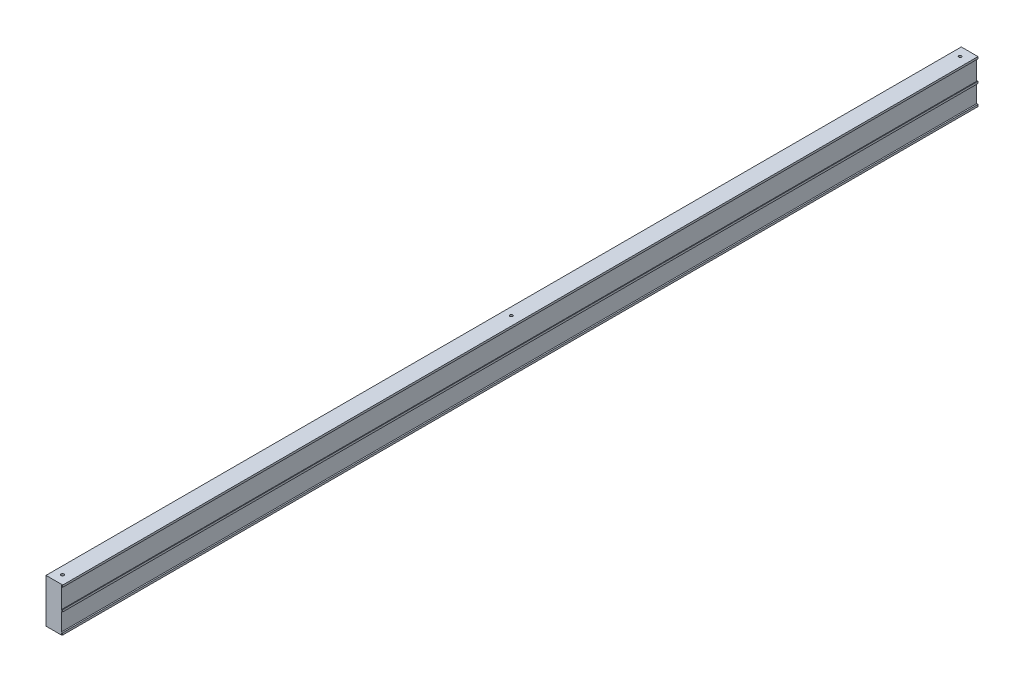
ISO-10303-21;
HEADER;
FILE_DESCRIPTION(('STEP AP214'),'2;1');
FILE_NAME('part.step','',(''),(''),'','','');
FILE_SCHEMA(('AUTOMOTIVE_DESIGN { 1 0 10303 214 1 1 1 1 }'));
ENDSEC;
DATA;
#1=APPLICATION_CONTEXT('core data for automotive mechanical design processes');
#2=APPLICATION_PROTOCOL_DEFINITION('international standard','automotive_design',2000,#1);
#3=PRODUCT_CONTEXT('',#1,'mechanical');
#4=PRODUCT('Part','Part','',(#3));
#5=PRODUCT_RELATED_PRODUCT_CATEGORY('part','',(#4));
#6=PRODUCT_DEFINITION_FORMATION('','',#4);
#7=PRODUCT_DEFINITION_CONTEXT('part definition',#1,'design');
#8=PRODUCT_DEFINITION('design','',#6,#7);
#9=PRODUCT_DEFINITION_SHAPE('','',#8);
#10=(LENGTH_UNIT() NAMED_UNIT(*) SI_UNIT(.MILLI.,.METRE.));
#11=(NAMED_UNIT(*) PLANE_ANGLE_UNIT() SI_UNIT($,.RADIAN.));
#12=(NAMED_UNIT(*) SI_UNIT($,.STERADIAN.) SOLID_ANGLE_UNIT());
#13=UNCERTAINTY_MEASURE_WITH_UNIT(LENGTH_MEASURE(1.E-05),#10,'distance_accuracy_value','');
#14=(GEOMETRIC_REPRESENTATION_CONTEXT(3) GLOBAL_UNCERTAINTY_ASSIGNED_CONTEXT((#13)) GLOBAL_UNIT_ASSIGNED_CONTEXT((#10,
#11,#12)) REPRESENTATION_CONTEXT('',''));
#15=CARTESIAN_POINT('',(0.,0.,0.));
#16=DIRECTION('',(0.,0.,1.));
#17=DIRECTION('',(1.,0.,0.));
#18=AXIS2_PLACEMENT_3D('',#15,#16,#17);
#19=CARTESIAN_POINT('',(-17.5,-50.,2080.));
#20=DIRECTION('',(1.,0.,0.));
#21=DIRECTION('',(0.,0.,-1.));
#22=AXIS2_PLACEMENT_3D('',#19,#20,#21);
#23=PLANE('',#22);
#24=DIRECTION('',(0.,-1.,0.));
#25=VECTOR('',#24,1.);
#26=CARTESIAN_POINT('',(-17.5,-50.,0.));
#27=LINE('',#26,#25);
#28=CARTESIAN_POINT('',(-17.5,50.,0.));
#29=VERTEX_POINT('',#28);
#30=CARTESIAN_POINT('',(-17.5,-50.,0.));
#31=VERTEX_POINT('',#30);
#32=EDGE_CURVE('E210',#29,#31,#27,.T.);
#33=ORIENTED_EDGE('',*,*,#32,.T.);
#34=DIRECTION('',(0.,0.,-1.));
#35=VECTOR('',#34,1.);
#36=CARTESIAN_POINT('',(-17.5,-50.,2080.));
#37=LINE('',#36,#35);
#38=CARTESIAN_POINT('',(-17.5,-50.,2080.));
#39=VERTEX_POINT('',#38);
#40=EDGE_CURVE('E46',#39,#31,#37,.T.);
#41=ORIENTED_EDGE('',*,*,#40,.F.);
#42=DIRECTION('',(0.,-1.,0.));
#43=VECTOR('',#42,1.);
#44=CARTESIAN_POINT('',(-17.5,-50.,2080.));
#45=LINE('',#44,#43);
#46=CARTESIAN_POINT('',(-17.5,50.,2080.));
#47=VERTEX_POINT('',#46);
#48=EDGE_CURVE('E134',#47,#39,#45,.T.);
#49=ORIENTED_EDGE('',*,*,#48,.F.);
#50=DIRECTION('',(0.,0.,-1.));
#51=VECTOR('',#50,1.);
#52=CARTESIAN_POINT('',(-17.5,50.,2080.));
#53=LINE('',#52,#51);
#54=EDGE_CURVE('E11',#47,#29,#53,.T.);
#55=ORIENTED_EDGE('',*,*,#54,.T.);
#56=EDGE_LOOP('',(#33,#41,#49,#55));
#57=FACE_BOUND('',#56,.T.);
#58=ADVANCED_FACE('F38',(#57),#23,.F.);
#59=CARTESIAN_POINT('',(-17.5,-50.,2080.));
#60=DIRECTION('',(0.,1.,0.));
#61=DIRECTION('',(0.,0.,1.));
#62=AXIS2_PLACEMENT_3D('',#59,#60,#61);
#63=PLANE('',#62);
#64=DIRECTION('',(1.,0.,0.));
#65=VECTOR('',#64,1.);
#66=CARTESIAN_POINT('',(-17.5,-50.,0.));
#67=LINE('',#66,#65);
#68=CARTESIAN_POINT('',(17.5,-50.,0.));
#69=VERTEX_POINT('',#68);
#70=EDGE_CURVE('E212',#31,#69,#67,.T.);
#71=ORIENTED_EDGE('',*,*,#70,.T.);
#72=DIRECTION('',(0.,0.,-1.));
#73=VECTOR('',#72,1.);
#74=CARTESIAN_POINT('',(17.5,-50.,2080.));
#75=LINE('',#74,#73);
#76=CARTESIAN_POINT('',(17.5,-50.,2080.));
#77=VERTEX_POINT('',#76);
#78=EDGE_CURVE('E290',#77,#69,#75,.T.);
#79=ORIENTED_EDGE('',*,*,#78,.F.);
#80=DIRECTION('',(1.,0.,0.));
#81=VECTOR('',#80,1.);
#82=CARTESIAN_POINT('',(-17.5,-50.,2080.));
#83=LINE('',#82,#81);
#84=EDGE_CURVE('E298',#39,#77,#83,.T.);
#85=ORIENTED_EDGE('',*,*,#84,.F.);
#86=ORIENTED_EDGE('',*,*,#40,.T.);
#87=EDGE_LOOP('',(#71,#79,#85,#86));
#88=FACE_BOUND('',#87,.T.);
#89=ADVANCED_FACE('F296',(#88),#63,.F.);
#90=CARTESIAN_POINT('',(17.5,-50.,2080.));
#91=DIRECTION('',(-1.,0.,0.));
#92=DIRECTION('',(0.,0.,1.));
#93=AXIS2_PLACEMENT_3D('',#90,#91,#92);
#94=PLANE('',#93);
#95=DIRECTION('',(0.,1.,0.));
#96=VECTOR('',#95,1.);
#97=CARTESIAN_POINT('',(17.5,-50.,0.));
#98=LINE('',#97,#96);
#99=CARTESIAN_POINT('',(17.5,-45.5,0.));
#100=VERTEX_POINT('',#99);
#101=EDGE_CURVE('E215',#69,#100,#98,.T.);
#102=ORIENTED_EDGE('',*,*,#101,.T.);
#103=DIRECTION('',(0.,0.,-1.));
#104=VECTOR('',#103,1.);
#105=CARTESIAN_POINT('',(17.5,-45.5,2080.));
#106=LINE('',#105,#104);
#107=CARTESIAN_POINT('',(17.5,-45.5,2080.));
#108=VERTEX_POINT('',#107);
#109=EDGE_CURVE('E287',#108,#100,#106,.T.);
#110=ORIENTED_EDGE('',*,*,#109,.F.);
#111=DIRECTION('',(0.,1.,0.));
#112=VECTOR('',#111,1.);
#113=CARTESIAN_POINT('',(17.5,-50.,2080.));
#114=LINE('',#113,#112);
#115=EDGE_CURVE('E317',#77,#108,#114,.T.);
#116=ORIENTED_EDGE('',*,*,#115,.F.);
#117=ORIENTED_EDGE('',*,*,#78,.T.);
#118=EDGE_LOOP('',(#102,#110,#116,#117));
#119=FACE_BOUND('',#118,.T.);
#120=ADVANCED_FACE('F308',(#119),#94,.F.);
#121=CARTESIAN_POINT('',(19.,-45.5,2080.));
#122=DIRECTION('',(0.,1.,0.));
#123=DIRECTION('',(0.,0.,1.));
#124=AXIS2_PLACEMENT_3D('',#121,#122,#123);
#125=PLANE('',#124);
#126=DIRECTION('',(1.,0.,0.));
#127=VECTOR('',#126,1.);
#128=CARTESIAN_POINT('',(19.,-45.5,0.));
#129=LINE('',#128,#127);
#130=CARTESIAN_POINT('',(19.,-45.5,0.));
#131=VERTEX_POINT('',#130);
#132=EDGE_CURVE('E217',#100,#131,#129,.T.);
#133=ORIENTED_EDGE('',*,*,#132,.T.);
#134=DIRECTION('',(0.,0.,-1.));
#135=VECTOR('',#134,1.);
#136=CARTESIAN_POINT('',(19.,-45.5,2080.));
#137=LINE('',#136,#135);
#138=CARTESIAN_POINT('',(19.,-45.5,2080.));
#139=VERTEX_POINT('',#138);
#140=EDGE_CURVE('E284',#139,#131,#137,.T.);
#141=ORIENTED_EDGE('',*,*,#140,.F.);
#142=DIRECTION('',(1.,0.,0.));
#143=VECTOR('',#142,1.);
#144=CARTESIAN_POINT('',(19.,-45.5,2080.));
#145=LINE('',#144,#143);
#146=EDGE_CURVE('E314',#108,#139,#145,.T.);
#147=ORIENTED_EDGE('',*,*,#146,.F.);
#148=ORIENTED_EDGE('',*,*,#109,.T.);
#149=EDGE_LOOP('',(#133,#141,#147,#148));
#150=FACE_BOUND('',#149,.T.);
#151=ADVANCED_FACE('F312',(#150),#125,.F.);
#152=CARTESIAN_POINT('',(19.,-48.5,2080.));
#153=DIRECTION('',(1.,0.,0.));
#154=DIRECTION('',(0.,1.,0.));
#155=AXIS2_PLACEMENT_3D('',#152,#153,#154);
#156=PLANE('',#155);
#157=DIRECTION('',(0.,-1.,0.));
#158=VECTOR('',#157,1.);
#159=CARTESIAN_POINT('',(19.,-48.5,0.));
#160=LINE('',#159,#158);
#161=CARTESIAN_POINT('',(19.,-48.5,0.));
#162=VERTEX_POINT('',#161);
#163=EDGE_CURVE('E219',#131,#162,#160,.T.);
#164=ORIENTED_EDGE('',*,*,#163,.T.);
#165=DIRECTION('',(0.,0.,-1.));
#166=VECTOR('',#165,1.);
#167=CARTESIAN_POINT('',(19.,-48.5,2080.));
#168=LINE('',#167,#166);
#169=CARTESIAN_POINT('',(19.,-48.5,2080.));
#170=VERTEX_POINT('',#169);
#171=EDGE_CURVE('E281',#170,#162,#168,.T.);
#172=ORIENTED_EDGE('',*,*,#171,.F.);
#173=DIRECTION('',(0.,-1.,0.));
#174=VECTOR('',#173,1.);
#175=CARTESIAN_POINT('',(19.,-48.5,2080.));
#176=LINE('',#175,#174);
#177=EDGE_CURVE('E316',#139,#170,#176,.T.);
#178=ORIENTED_EDGE('',*,*,#177,.F.);
#179=ORIENTED_EDGE('',*,*,#140,.T.);
#180=EDGE_LOOP('',(#164,#172,#178,#179));
#181=FACE_BOUND('',#180,.T.);
#182=ADVANCED_FACE('F417',(#181),#156,.F.);
#183=CARTESIAN_POINT('',(20.5,-48.5,2080.));
#184=DIRECTION('',(0.,1.,0.));
#185=DIRECTION('',(0.,0.,1.));
#186=AXIS2_PLACEMENT_3D('',#183,#184,#185);
#187=PLANE('',#186);
#188=DIRECTION('',(1.,0.,0.));
#189=VECTOR('',#188,1.);
#190=CARTESIAN_POINT('',(20.5,-48.5,0.));
#191=LINE('',#190,#189);
#192=CARTESIAN_POINT('',(20.5,-48.5,0.));
#193=VERTEX_POINT('',#192);
#194=EDGE_CURVE('E221',#162,#193,#191,.T.);
#195=ORIENTED_EDGE('',*,*,#194,.T.);
#196=DIRECTION('',(0.,0.,-1.));
#197=VECTOR('',#196,1.);
#198=CARTESIAN_POINT('',(20.5,-48.5,2080.));
#199=LINE('',#198,#197);
#200=CARTESIAN_POINT('',(20.5,-48.5,2080.));
#201=VERTEX_POINT('',#200);
#202=EDGE_CURVE('E278',#201,#193,#199,.T.);
#203=ORIENTED_EDGE('',*,*,#202,.F.);
#204=DIRECTION('',(1.,0.,0.));
#205=VECTOR('',#204,1.);
#206=CARTESIAN_POINT('',(20.5,-48.5,2080.));
#207=LINE('',#206,#205);
#208=EDGE_CURVE('E319',#170,#201,#207,.T.);
#209=ORIENTED_EDGE('',*,*,#208,.F.);
#210=ORIENTED_EDGE('',*,*,#171,.T.);
#211=EDGE_LOOP('',(#195,#203,#209,#210));
#212=FACE_BOUND('',#211,.T.);
#213=ADVANCED_FACE('F420',(#212),#187,.F.);
#214=CARTESIAN_POINT('',(20.5,-44.,2080.));
#215=DIRECTION('',(-1.,0.,0.));
#216=DIRECTION('',(0.,0.,1.));
#217=AXIS2_PLACEMENT_3D('',#214,#215,#216);
#218=PLANE('',#217);
#219=DIRECTION('',(0.,1.,0.));
#220=VECTOR('',#219,1.);
#221=CARTESIAN_POINT('',(20.5,-44.,0.));
#222=LINE('',#221,#220);
#223=CARTESIAN_POINT('',(20.5,-44.,0.));
#224=VERTEX_POINT('',#223);
#225=EDGE_CURVE('E223',#193,#224,#222,.T.);
#226=ORIENTED_EDGE('',*,*,#225,.T.);
#227=DIRECTION('',(0.,0.,-1.));
#228=VECTOR('',#227,1.);
#229=CARTESIAN_POINT('',(20.5,-44.,2080.));
#230=LINE('',#229,#228);
#231=CARTESIAN_POINT('',(20.5,-44.,2080.));
#232=VERTEX_POINT('',#231);
#233=EDGE_CURVE('E275',#232,#224,#230,.T.);
#234=ORIENTED_EDGE('',*,*,#233,.F.);
#235=DIRECTION('',(0.,1.,0.));
#236=VECTOR('',#235,1.);
#237=CARTESIAN_POINT('',(20.5,-44.,2080.));
#238=LINE('',#237,#236);
#239=EDGE_CURVE('E325',#201,#232,#238,.T.);
#240=ORIENTED_EDGE('',*,*,#239,.F.);
#241=ORIENTED_EDGE('',*,*,#202,.T.);
#242=EDGE_LOOP('',(#226,#234,#240,#241));
#243=FACE_BOUND('',#242,.T.);
#244=ADVANCED_FACE('F424',(#243),#218,.F.);
#245=CARTESIAN_POINT('',(17.5,-44.,2080.));
#246=DIRECTION('',(0.,-1.,0.));
#247=DIRECTION('',(1.,0.,0.));
#248=AXIS2_PLACEMENT_3D('',#245,#246,#247);
#249=PLANE('',#248);
#250=DIRECTION('',(-1.,0.,0.));
#251=VECTOR('',#250,1.);
#252=CARTESIAN_POINT('',(17.5,-44.,0.));
#253=LINE('',#252,#251);
#254=CARTESIAN_POINT('',(17.5,-44.,0.));
#255=VERTEX_POINT('',#254);
#256=EDGE_CURVE('E225',#224,#255,#253,.T.);
#257=ORIENTED_EDGE('',*,*,#256,.T.);
#258=DIRECTION('',(0.,0.,-1.));
#259=VECTOR('',#258,1.);
#260=CARTESIAN_POINT('',(17.5,-44.,2080.));
#261=LINE('',#260,#259);
#262=CARTESIAN_POINT('',(17.5,-44.,2080.));
#263=VERTEX_POINT('',#262);
#264=EDGE_CURVE('E272',#263,#255,#261,.T.);
#265=ORIENTED_EDGE('',*,*,#264,.F.);
#266=DIRECTION('',(-1.,0.,0.));
#267=VECTOR('',#266,1.);
#268=CARTESIAN_POINT('',(17.5,-44.,2080.));
#269=LINE('',#268,#267);
#270=EDGE_CURVE('E327',#232,#263,#269,.T.);
#271=ORIENTED_EDGE('',*,*,#270,.F.);
#272=ORIENTED_EDGE('',*,*,#233,.T.);
#273=EDGE_LOOP('',(#257,#265,#271,#272));
#274=FACE_BOUND('',#273,.T.);
#275=ADVANCED_FACE('F428',(#274),#249,.F.);
#276=CARTESIAN_POINT('',(17.5,-44.,2080.));
#277=DIRECTION('',(-1.,0.,0.));
#278=DIRECTION('',(0.,0.,1.));
#279=AXIS2_PLACEMENT_3D('',#276,#277,#278);
#280=PLANE('',#279);
#281=DIRECTION('',(0.,1.,0.));
#282=VECTOR('',#281,1.);
#283=CARTESIAN_POINT('',(17.5,-44.,0.));
#284=LINE('',#283,#282);
#285=CARTESIAN_POINT('',(17.5,-3.,0.));
#286=VERTEX_POINT('',#285);
#287=EDGE_CURVE('E227',#255,#286,#284,.T.);
#288=ORIENTED_EDGE('',*,*,#287,.T.);
#289=DIRECTION('',(0.,0.,-1.));
#290=VECTOR('',#289,1.);
#291=CARTESIAN_POINT('',(17.5,-3.,2080.));
#292=LINE('',#291,#290);
#293=CARTESIAN_POINT('',(17.5,-3.,2080.));
#294=VERTEX_POINT('',#293);
#295=EDGE_CURVE('E269',#294,#286,#292,.T.);
#296=ORIENTED_EDGE('',*,*,#295,.F.);
#297=DIRECTION('',(0.,1.,0.));
#298=VECTOR('',#297,1.);
#299=CARTESIAN_POINT('',(17.5,-44.,2080.));
#300=LINE('',#299,#298);
#301=EDGE_CURVE('E329',#263,#294,#300,.T.);
#302=ORIENTED_EDGE('',*,*,#301,.F.);
#303=ORIENTED_EDGE('',*,*,#264,.T.);
#304=EDGE_LOOP('',(#288,#296,#302,#303));
#305=FACE_BOUND('',#304,.T.);
#306=ADVANCED_FACE('F432',(#305),#280,.F.);
#307=CARTESIAN_POINT('',(17.5,-3.,2080.));
#308=DIRECTION('',(0.,1.,0.));
#309=DIRECTION('',(-1.,0.,0.));
#310=AXIS2_PLACEMENT_3D('',#307,#308,#309);
#311=PLANE('',#310);
#312=DIRECTION('',(1.,0.,0.));
#313=VECTOR('',#312,1.);
#314=CARTESIAN_POINT('',(17.5,-3.,0.));
#315=LINE('',#314,#313);
#316=CARTESIAN_POINT('',(20.5,-3.,0.));
#317=VERTEX_POINT('',#316);
#318=EDGE_CURVE('E229',#286,#317,#315,.T.);
#319=ORIENTED_EDGE('',*,*,#318,.T.);
#320=DIRECTION('',(0.,0.,-1.));
#321=VECTOR('',#320,1.);
#322=CARTESIAN_POINT('',(20.5,-3.,2080.));
#323=LINE('',#322,#321);
#324=CARTESIAN_POINT('',(20.5,-3.,2080.));
#325=VERTEX_POINT('',#324);
#326=EDGE_CURVE('E266',#325,#317,#323,.T.);
#327=ORIENTED_EDGE('',*,*,#326,.F.);
#328=DIRECTION('',(1.,0.,0.));
#329=VECTOR('',#328,1.);
#330=CARTESIAN_POINT('',(17.5,-3.,2080.));
#331=LINE('',#330,#329);
#332=EDGE_CURVE('E331',#294,#325,#331,.T.);
#333=ORIENTED_EDGE('',*,*,#332,.F.);
#334=ORIENTED_EDGE('',*,*,#295,.T.);
#335=EDGE_LOOP('',(#319,#327,#333,#334));
#336=FACE_BOUND('',#335,.T.);
#337=ADVANCED_FACE('F436',(#336),#311,.F.);
#338=CARTESIAN_POINT('',(20.5,-3.,2080.));
#339=DIRECTION('',(-1.,0.,0.));
#340=DIRECTION('',(0.,0.,1.));
#341=AXIS2_PLACEMENT_3D('',#338,#339,#340);
#342=PLANE('',#341);
#343=DIRECTION('',(0.,1.,0.));
#344=VECTOR('',#343,1.);
#345=CARTESIAN_POINT('',(20.5,-3.,0.));
#346=LINE('',#345,#344);
#347=CARTESIAN_POINT('',(20.5,1.5,0.));
#348=VERTEX_POINT('',#347);
#349=EDGE_CURVE('E231',#317,#348,#346,.T.);
#350=ORIENTED_EDGE('',*,*,#349,.T.);
#351=DIRECTION('',(0.,0.,-1.));
#352=VECTOR('',#351,1.);
#353=CARTESIAN_POINT('',(20.5,1.5,2080.));
#354=LINE('',#353,#352);
#355=CARTESIAN_POINT('',(20.5,1.5,2080.));
#356=VERTEX_POINT('',#355);
#357=EDGE_CURVE('E263',#356,#348,#354,.T.);
#358=ORIENTED_EDGE('',*,*,#357,.F.);
#359=DIRECTION('',(0.,1.,0.));
#360=VECTOR('',#359,1.);
#361=CARTESIAN_POINT('',(20.5,-3.,2080.));
#362=LINE('',#361,#360);
#363=EDGE_CURVE('E333',#325,#356,#362,.T.);
#364=ORIENTED_EDGE('',*,*,#363,.F.);
#365=ORIENTED_EDGE('',*,*,#326,.T.);
#366=EDGE_LOOP('',(#350,#358,#364,#365));
#367=FACE_BOUND('',#366,.T.);
#368=ADVANCED_FACE('F440',(#367),#342,.F.);
#369=CARTESIAN_POINT('',(20.5,1.5,2080.));
#370=DIRECTION('',(0.,-1.,0.));
#371=DIRECTION('',(1.,0.,0.));
#372=AXIS2_PLACEMENT_3D('',#369,#370,#371);
#373=PLANE('',#372);
#374=DIRECTION('',(-1.,0.,0.));
#375=VECTOR('',#374,1.);
#376=CARTESIAN_POINT('',(20.5,1.5,0.));
#377=LINE('',#376,#375);
#378=CARTESIAN_POINT('',(19.,1.5,0.));
#379=VERTEX_POINT('',#378);
#380=EDGE_CURVE('E233',#348,#379,#377,.T.);
#381=ORIENTED_EDGE('',*,*,#380,.T.);
#382=DIRECTION('',(0.,0.,-1.));
#383=VECTOR('',#382,1.);
#384=CARTESIAN_POINT('',(19.,1.5,2080.));
#385=LINE('',#384,#383);
#386=CARTESIAN_POINT('',(19.,1.5,2080.));
#387=VERTEX_POINT('',#386);
#388=EDGE_CURVE('E260',#387,#379,#385,.T.);
#389=ORIENTED_EDGE('',*,*,#388,.F.);
#390=DIRECTION('',(-1.,0.,0.));
#391=VECTOR('',#390,1.);
#392=CARTESIAN_POINT('',(20.5,1.5,2080.));
#393=LINE('',#392,#391);
#394=EDGE_CURVE('E335',#356,#387,#393,.T.);
#395=ORIENTED_EDGE('',*,*,#394,.F.);
#396=ORIENTED_EDGE('',*,*,#357,.T.);
#397=EDGE_LOOP('',(#381,#389,#395,#396));
#398=FACE_BOUND('',#397,.T.);
#399=ADVANCED_FACE('F444',(#398),#373,.F.);
#400=CARTESIAN_POINT('',(19.,1.5,2080.));
#401=DIRECTION('',(1.,0.,0.));
#402=DIRECTION('',(0.,0.,-1.));
#403=AXIS2_PLACEMENT_3D('',#400,#401,#402);
#404=PLANE('',#403);
#405=DIRECTION('',(0.,-1.,0.));
#406=VECTOR('',#405,1.);
#407=CARTESIAN_POINT('',(19.,1.5,0.));
#408=LINE('',#407,#406);
#409=CARTESIAN_POINT('',(19.,-1.5,0.));
#410=VERTEX_POINT('',#409);
#411=EDGE_CURVE('E235',#379,#410,#408,.T.);
#412=ORIENTED_EDGE('',*,*,#411,.T.);
#413=DIRECTION('',(0.,0.,-1.));
#414=VECTOR('',#413,1.);
#415=CARTESIAN_POINT('',(19.,-1.5,2080.));
#416=LINE('',#415,#414);
#417=CARTESIAN_POINT('',(19.,-1.5,2080.));
#418=VERTEX_POINT('',#417);
#419=EDGE_CURVE('E257',#418,#410,#416,.T.);
#420=ORIENTED_EDGE('',*,*,#419,.F.);
#421=DIRECTION('',(0.,-1.,0.));
#422=VECTOR('',#421,1.);
#423=CARTESIAN_POINT('',(19.,1.5,2080.));
#424=LINE('',#423,#422);
#425=EDGE_CURVE('E337',#387,#418,#424,.T.);
#426=ORIENTED_EDGE('',*,*,#425,.F.);
#427=ORIENTED_EDGE('',*,*,#388,.T.);
#428=EDGE_LOOP('',(#412,#420,#426,#427));
#429=FACE_BOUND('',#428,.T.);
#430=ADVANCED_FACE('F448',(#429),#404,.F.);
#431=CARTESIAN_POINT('',(19.,-1.5,2080.));
#432=DIRECTION('',(0.,-1.,0.));
#433=DIRECTION('',(1.,0.,0.));
#434=AXIS2_PLACEMENT_3D('',#431,#432,#433);
#435=PLANE('',#434);
#436=DIRECTION('',(-1.,0.,0.));
#437=VECTOR('',#436,1.);
#438=CARTESIAN_POINT('',(19.,-1.5,0.));
#439=LINE('',#438,#437);
#440=CARTESIAN_POINT('',(17.5,-1.5,0.));
#441=VERTEX_POINT('',#440);
#442=EDGE_CURVE('E237',#410,#441,#439,.T.);
#443=ORIENTED_EDGE('',*,*,#442,.T.);
#444=DIRECTION('',(0.,0.,-1.));
#445=VECTOR('',#444,1.);
#446=CARTESIAN_POINT('',(17.5,-1.5,2080.));
#447=LINE('',#446,#445);
#448=CARTESIAN_POINT('',(17.5,-1.5,2080.));
#449=VERTEX_POINT('',#448);
#450=EDGE_CURVE('E254',#449,#441,#447,.T.);
#451=ORIENTED_EDGE('',*,*,#450,.F.);
#452=DIRECTION('',(-1.,0.,0.));
#453=VECTOR('',#452,1.);
#454=CARTESIAN_POINT('',(19.,-1.5,2080.));
#455=LINE('',#454,#453);
#456=EDGE_CURVE('E339',#418,#449,#455,.T.);
#457=ORIENTED_EDGE('',*,*,#456,.F.);
#458=ORIENTED_EDGE('',*,*,#419,.T.);
#459=EDGE_LOOP('',(#443,#451,#457,#458));
#460=FACE_BOUND('',#459,.T.);
#461=ADVANCED_FACE('F452',(#460),#435,.F.);
#462=CARTESIAN_POINT('',(17.5,-1.5,2080.));
#463=DIRECTION('',(-1.,0.,0.));
#464=DIRECTION('',(0.,0.,1.));
#465=AXIS2_PLACEMENT_3D('',#462,#463,#464);
#466=PLANE('',#465);
#467=DIRECTION('',(0.,1.,0.));
#468=VECTOR('',#467,1.);
#469=CARTESIAN_POINT('',(17.5,-1.5,0.));
#470=LINE('',#469,#468);
#471=CARTESIAN_POINT('',(17.5,48.5,0.));
#472=VERTEX_POINT('',#471);
#473=EDGE_CURVE('E239',#441,#472,#470,.T.);
#474=ORIENTED_EDGE('',*,*,#473,.T.);
#475=DIRECTION('',(0.,0.,-1.));
#476=VECTOR('',#475,1.);
#477=CARTESIAN_POINT('',(17.5,48.5,2080.));
#478=LINE('',#477,#476);
#479=CARTESIAN_POINT('',(17.5,48.5,2080.));
#480=VERTEX_POINT('',#479);
#481=EDGE_CURVE('E251',#480,#472,#478,.T.);
#482=ORIENTED_EDGE('',*,*,#481,.F.);
#483=DIRECTION('',(0.,1.,0.));
#484=VECTOR('',#483,1.);
#485=CARTESIAN_POINT('',(17.5,-1.5,2080.));
#486=LINE('',#485,#484);
#487=EDGE_CURVE('E341',#449,#480,#486,.T.);
#488=ORIENTED_EDGE('',*,*,#487,.F.);
#489=ORIENTED_EDGE('',*,*,#450,.T.);
#490=EDGE_LOOP('',(#474,#482,#488,#489));
#491=FACE_BOUND('',#490,.T.);
#492=ADVANCED_FACE('F347',(#491),#466,.F.);
#493=CARTESIAN_POINT('',(19.,48.5,2080.));
#494=DIRECTION('',(0.,1.,0.));
#495=DIRECTION('',(0.,0.,1.));
#496=AXIS2_PLACEMENT_3D('',#493,#494,#495);
#497=PLANE('',#496);
#498=DIRECTION('',(1.,0.,0.));
#499=VECTOR('',#498,1.);
#500=CARTESIAN_POINT('',(19.,48.5,0.));
#501=LINE('',#500,#499);
#502=CARTESIAN_POINT('',(19.,48.5,0.));
#503=VERTEX_POINT('',#502);
#504=EDGE_CURVE('E241',#472,#503,#501,.T.);
#505=ORIENTED_EDGE('',*,*,#504,.T.);
#506=DIRECTION('',(0.,0.,-1.));
#507=VECTOR('',#506,1.);
#508=CARTESIAN_POINT('',(19.,48.5,2080.));
#509=LINE('',#508,#507);
#510=CARTESIAN_POINT('',(19.,48.5,2080.));
#511=VERTEX_POINT('',#510);
#512=EDGE_CURVE('E199',#511,#503,#509,.T.);
#513=ORIENTED_EDGE('',*,*,#512,.F.);
#514=DIRECTION('',(1.,0.,0.));
#515=VECTOR('',#514,1.);
#516=CARTESIAN_POINT('',(19.,48.5,2080.));
#517=LINE('',#516,#515);
#518=EDGE_CURVE('E190',#480,#511,#517,.T.);
#519=ORIENTED_EDGE('',*,*,#518,.F.);
#520=ORIENTED_EDGE('',*,*,#481,.T.);
#521=EDGE_LOOP('',(#505,#513,#519,#520));
#522=FACE_BOUND('',#521,.T.);
#523=ADVANCED_FACE('F351',(#522),#497,.F.);
#524=CARTESIAN_POINT('',(19.,45.5,2080.));
#525=DIRECTION('',(1.,0.,0.));
#526=DIRECTION('',(0.,1.,0.));
#527=AXIS2_PLACEMENT_3D('',#524,#525,#526);
#528=PLANE('',#527);
#529=DIRECTION('',(0.,-1.,0.));
#530=VECTOR('',#529,1.);
#531=CARTESIAN_POINT('',(19.,45.5,0.));
#532=LINE('',#531,#530);
#533=CARTESIAN_POINT('',(19.,45.5,0.));
#534=VERTEX_POINT('',#533);
#535=EDGE_CURVE('E198',#503,#534,#532,.T.);
#536=ORIENTED_EDGE('',*,*,#535,.T.);
#537=DIRECTION('',(0.,0.,-1.));
#538=VECTOR('',#537,1.);
#539=CARTESIAN_POINT('',(19.,45.5,2080.));
#540=LINE('',#539,#538);
#541=CARTESIAN_POINT('',(19.,45.5,2080.));
#542=VERTEX_POINT('',#541);
#543=EDGE_CURVE('E195',#542,#534,#540,.T.);
#544=ORIENTED_EDGE('',*,*,#543,.F.);
#545=DIRECTION('',(0.,-1.,0.));
#546=VECTOR('',#545,1.);
#547=CARTESIAN_POINT('',(19.,45.5,2080.));
#548=LINE('',#547,#546);
#549=EDGE_CURVE('E184',#511,#542,#548,.T.);
#550=ORIENTED_EDGE('',*,*,#549,.F.);
#551=ORIENTED_EDGE('',*,*,#512,.T.);
#552=EDGE_LOOP('',(#536,#544,#550,#551));
#553=FACE_BOUND('',#552,.T.);
#554=ADVANCED_FACE('F196',(#553),#528,.F.);
#555=CARTESIAN_POINT('',(20.5,45.5,2080.));
#556=DIRECTION('',(0.,1.,0.));
#557=DIRECTION('',(0.,0.,1.));
#558=AXIS2_PLACEMENT_3D('',#555,#556,#557);
#559=PLANE('',#558);
#560=DIRECTION('',(1.,0.,0.));
#561=VECTOR('',#560,1.);
#562=CARTESIAN_POINT('',(20.5,45.5,0.));
#563=LINE('',#562,#561);
#564=CARTESIAN_POINT('',(20.5,45.5,0.));
#565=VERTEX_POINT('',#564);
#566=EDGE_CURVE('E120',#534,#565,#563,.T.);
#567=ORIENTED_EDGE('',*,*,#566,.T.);
#568=DIRECTION('',(0.,0.,-1.));
#569=VECTOR('',#568,1.);
#570=CARTESIAN_POINT('',(20.5,45.5,2080.));
#571=LINE('',#570,#569);
#572=CARTESIAN_POINT('',(20.5,45.5,2080.));
#573=VERTEX_POINT('',#572);
#574=EDGE_CURVE('E200',#573,#565,#571,.T.);
#575=ORIENTED_EDGE('',*,*,#574,.F.);
#576=DIRECTION('',(1.,0.,0.));
#577=VECTOR('',#576,1.);
#578=CARTESIAN_POINT('',(20.5,45.5,2080.));
#579=LINE('',#578,#577);
#580=EDGE_CURVE('E188',#542,#573,#579,.T.);
#581=ORIENTED_EDGE('',*,*,#580,.F.);
#582=ORIENTED_EDGE('',*,*,#543,.T.);
#583=EDGE_LOOP('',(#567,#575,#581,#582));
#584=FACE_BOUND('',#583,.T.);
#585=ADVANCED_FACE('F202',(#584),#559,.F.);
#586=CARTESIAN_POINT('',(20.5,50.,2080.));
#587=DIRECTION('',(-1.,0.,0.));
#588=DIRECTION('',(0.,0.,1.));
#589=AXIS2_PLACEMENT_3D('',#586,#587,#588);
#590=PLANE('',#589);
#591=DIRECTION('',(0.,1.,0.));
#592=VECTOR('',#591,1.);
#593=CARTESIAN_POINT('',(20.5,50.,0.));
#594=LINE('',#593,#592);
#595=CARTESIAN_POINT('',(20.5,50.,0.));
#596=VERTEX_POINT('',#595);
#597=EDGE_CURVE('E127',#565,#596,#594,.T.);
#598=ORIENTED_EDGE('',*,*,#597,.T.);
#599=DIRECTION('',(0.,0.,-1.));
#600=VECTOR('',#599,1.);
#601=CARTESIAN_POINT('',(20.5,50.,2080.));
#602=LINE('',#601,#600);
#603=CARTESIAN_POINT('',(20.5,50.,2080.));
#604=VERTEX_POINT('',#603);
#605=EDGE_CURVE('E206',#604,#596,#602,.T.);
#606=ORIENTED_EDGE('',*,*,#605,.F.);
#607=DIRECTION('',(0.,1.,0.));
#608=VECTOR('',#607,1.);
#609=CARTESIAN_POINT('',(20.5,50.,2080.));
#610=LINE('',#609,#608);
#611=EDGE_CURVE('E204',#573,#604,#610,.T.);
#612=ORIENTED_EDGE('',*,*,#611,.F.);
#613=ORIENTED_EDGE('',*,*,#574,.T.);
#614=EDGE_LOOP('',(#598,#606,#612,#613));
#615=FACE_BOUND('',#614,.T.);
#616=ADVANCED_FACE('F353',(#615),#590,.F.);
#617=CARTESIAN_POINT('',(17.5,50.,2080.));
#618=DIRECTION('',(0.,-1.,0.));
#619=DIRECTION('',(0.,0.,-1.));
#620=AXIS2_PLACEMENT_3D('',#617,#618,#619);
#621=PLANE('',#620);
#622=CARTESIAN_POINT('',(0.,50.,20.));
#623=DIRECTION('',(0.,1.,0.));
#624=DIRECTION('',(0.,0.,1.));
#625=AXIS2_PLACEMENT_3D('',#622,#623,#624);
#626=CIRCLE('',#625,3.175);
#627=CARTESIAN_POINT('',(0.,50.,23.175));
#628=VERTEX_POINT('',#627);
#629=EDGE_CURVE('E369',#628,#628,#626,.T.);
#630=ORIENTED_EDGE('',*,*,#629,.F.);
#631=EDGE_LOOP('',(#630));
#632=FACE_BOUND('',#631,.T.);
#633=CARTESIAN_POINT('',(0.,50.,1040.));
#634=DIRECTION('',(0.,1.,0.));
#635=DIRECTION('',(0.,0.,1.));
#636=AXIS2_PLACEMENT_3D('',#633,#634,#635);
#637=CIRCLE('',#636,3.17500000000003);
#638=CARTESIAN_POINT('',(0.,50.,1043.175));
#639=VERTEX_POINT('',#638);
#640=EDGE_CURVE('E363',#639,#639,#637,.T.);
#641=ORIENTED_EDGE('',*,*,#640,.F.);
#642=EDGE_LOOP('',(#641));
#643=FACE_BOUND('',#642,.T.);
#644=CARTESIAN_POINT('',(0.,50.,2060.));
#645=DIRECTION('',(0.,1.,0.));
#646=DIRECTION('',(0.,0.,1.));
#647=AXIS2_PLACEMENT_3D('',#644,#645,#646);
#648=CIRCLE('',#647,3.17499999999993);
#649=CARTESIAN_POINT('',(0.,50.,2063.175));
#650=VERTEX_POINT('',#649);
#651=EDGE_CURVE('E357',#650,#650,#648,.T.);
#652=ORIENTED_EDGE('',*,*,#651,.F.);
#653=EDGE_LOOP('',(#652));
#654=FACE_BOUND('',#653,.T.);
#655=DIRECTION('',(-1.,0.,0.));
#656=VECTOR('',#655,1.);
#657=CARTESIAN_POINT('',(17.5,50.,0.));
#658=LINE('',#657,#656);
#659=EDGE_CURVE('E246',#596,#29,#658,.T.);
#660=ORIENTED_EDGE('',*,*,#659,.T.);
#661=ORIENTED_EDGE('',*,*,#54,.F.);
#662=DIRECTION('',(-1.,0.,0.));
#663=VECTOR('',#662,1.);
#664=CARTESIAN_POINT('',(-17.5,50.,2080.));
#665=LINE('',#664,#663);
#666=EDGE_CURVE('E54',#604,#47,#665,.T.);
#667=ORIENTED_EDGE('',*,*,#666,.F.);
#668=ORIENTED_EDGE('',*,*,#605,.T.);
#669=EDGE_LOOP('',(#660,#661,#667,#668));
#670=FACE_BOUND('',#669,.T.);
#671=ADVANCED_FACE('F352',(#632,#643,#654,#670),#621,.F.);
#672=CARTESIAN_POINT('',(0.,0.,2080.));
#673=DIRECTION('',(0.,0.,-1.));
#674=DIRECTION('',(-1.,0.,0.));
#675=AXIS2_PLACEMENT_3D('',#672,#673,#674);
#676=PLANE('',#675);
#677=ORIENTED_EDGE('',*,*,#666,.T.);
#678=ORIENTED_EDGE('',*,*,#48,.T.);
#679=ORIENTED_EDGE('',*,*,#84,.T.);
#680=ORIENTED_EDGE('',*,*,#115,.T.);
#681=ORIENTED_EDGE('',*,*,#146,.T.);
#682=ORIENTED_EDGE('',*,*,#177,.T.);
#683=ORIENTED_EDGE('',*,*,#208,.T.);
#684=ORIENTED_EDGE('',*,*,#239,.T.);
#685=ORIENTED_EDGE('',*,*,#270,.T.);
#686=ORIENTED_EDGE('',*,*,#301,.T.);
#687=ORIENTED_EDGE('',*,*,#332,.T.);
#688=ORIENTED_EDGE('',*,*,#363,.T.);
#689=ORIENTED_EDGE('',*,*,#394,.T.);
#690=ORIENTED_EDGE('',*,*,#425,.T.);
#691=ORIENTED_EDGE('',*,*,#456,.T.);
#692=ORIENTED_EDGE('',*,*,#487,.T.);
#693=ORIENTED_EDGE('',*,*,#518,.T.);
#694=ORIENTED_EDGE('',*,*,#549,.T.);
#695=ORIENTED_EDGE('',*,*,#580,.T.);
#696=ORIENTED_EDGE('',*,*,#611,.T.);
#697=EDGE_LOOP('',(#677,#678,#679,#680,#681,#682,#683,#684,#685,#686,#687,#688,#689,#690,#691,
#692,#693,#694,#695,#696));
#698=FACE_BOUND('',#697,.T.);
#699=ADVANCED_FACE('F186',(#698),#676,.F.);
#700=CARTESIAN_POINT('',(0.,0.,0.));
#701=DIRECTION('',(0.,0.,-1.));
#702=DIRECTION('',(-1.,0.,0.));
#703=AXIS2_PLACEMENT_3D('',#700,#701,#702);
#704=PLANE('',#703);
#705=ORIENTED_EDGE('',*,*,#32,.F.);
#706=ORIENTED_EDGE('',*,*,#659,.F.);
#707=ORIENTED_EDGE('',*,*,#597,.F.);
#708=ORIENTED_EDGE('',*,*,#566,.F.);
#709=ORIENTED_EDGE('',*,*,#535,.F.);
#710=ORIENTED_EDGE('',*,*,#504,.F.);
#711=ORIENTED_EDGE('',*,*,#473,.F.);
#712=ORIENTED_EDGE('',*,*,#442,.F.);
#713=ORIENTED_EDGE('',*,*,#411,.F.);
#714=ORIENTED_EDGE('',*,*,#380,.F.);
#715=ORIENTED_EDGE('',*,*,#349,.F.);
#716=ORIENTED_EDGE('',*,*,#318,.F.);
#717=ORIENTED_EDGE('',*,*,#287,.F.);
#718=ORIENTED_EDGE('',*,*,#256,.F.);
#719=ORIENTED_EDGE('',*,*,#225,.F.);
#720=ORIENTED_EDGE('',*,*,#194,.F.);
#721=ORIENTED_EDGE('',*,*,#163,.F.);
#722=ORIENTED_EDGE('',*,*,#132,.F.);
#723=ORIENTED_EDGE('',*,*,#101,.F.);
#724=ORIENTED_EDGE('',*,*,#70,.F.);
#725=EDGE_LOOP('',(#705,#706,#707,#708,#709,#710,#711,#712,#713,#714,#715,#716,#717,#718,#719,
#720,#721,#722,#723,#724));
#726=FACE_BOUND('',#725,.T.);
#727=ADVANCED_FACE('F302',(#726),#704,.T.);
#728=CARTESIAN_POINT('',(0.,20.,2060.));
#729=DIRECTION('',(0.,1.,0.));
#730=DIRECTION('',(0.,0.,1.));
#731=AXIS2_PLACEMENT_3D('',#728,#729,#730);
#732=CYLINDRICAL_SURFACE('',#731,3.17499999999993);
#733=CARTESIAN_POINT('',(0.,20.,2060.));
#734=DIRECTION('',(0.,1.,0.));
#735=DIRECTION('',(0.,0.,1.));
#736=AXIS2_PLACEMENT_3D('',#733,#734,#735);
#737=CIRCLE('',#736,3.17499999999993);
#738=CARTESIAN_POINT('',(0.,20.,2063.175));
#739=VERTEX_POINT('',#738);
#740=EDGE_CURVE('E360',#739,#739,#737,.T.);
#741=ORIENTED_EDGE('',*,*,#740,.F.);
#742=EDGE_LOOP('',(#741));
#743=FACE_BOUND('',#742,.T.);
#744=ORIENTED_EDGE('',*,*,#651,.T.);
#745=EDGE_LOOP('',(#744));
#746=FACE_BOUND('',#745,.T.);
#747=ADVANCED_FACE('F391',(#743,#746),#732,.F.);
#748=CARTESIAN_POINT('',(0.,20.,2060.));
#749=DIRECTION('',(0.,1.,0.));
#750=DIRECTION('',(0.,0.,1.));
#751=AXIS2_PLACEMENT_3D('',#748,#749,#750);
#752=PLANE('',#751);
#753=ORIENTED_EDGE('',*,*,#740,.T.);
#754=EDGE_LOOP('',(#753));
#755=FACE_BOUND('',#754,.T.);
#756=ADVANCED_FACE('F393',(#755),#752,.T.);
#757=CARTESIAN_POINT('',(0.,20.,1040.));
#758=DIRECTION('',(0.,1.,0.));
#759=DIRECTION('',(0.,0.,1.));
#760=AXIS2_PLACEMENT_3D('',#757,#758,#759);
#761=CYLINDRICAL_SURFACE('',#760,3.17500000000003);
#762=CARTESIAN_POINT('',(0.,20.,1040.));
#763=DIRECTION('',(0.,1.,0.));
#764=DIRECTION('',(0.,0.,1.));
#765=AXIS2_PLACEMENT_3D('',#762,#763,#764);
#766=CIRCLE('',#765,3.17500000000003);
#767=CARTESIAN_POINT('',(0.,20.,1043.175));
#768=VERTEX_POINT('',#767);
#769=EDGE_CURVE('E366',#768,#768,#766,.T.);
#770=ORIENTED_EDGE('',*,*,#769,.F.);
#771=EDGE_LOOP('',(#770));
#772=FACE_BOUND('',#771,.T.);
#773=ORIENTED_EDGE('',*,*,#640,.T.);
#774=EDGE_LOOP('',(#773));
#775=FACE_BOUND('',#774,.T.);
#776=ADVANCED_FACE('F400',(#772,#775),#761,.F.);
#777=CARTESIAN_POINT('',(0.,20.,1040.));
#778=DIRECTION('',(0.,1.,0.));
#779=DIRECTION('',(0.,0.,1.));
#780=AXIS2_PLACEMENT_3D('',#777,#778,#779);
#781=PLANE('',#780);
#782=ORIENTED_EDGE('',*,*,#769,.T.);
#783=EDGE_LOOP('',(#782));
#784=FACE_BOUND('',#783,.T.);
#785=ADVANCED_FACE('F380',(#784),#781,.T.);
#786=CARTESIAN_POINT('',(0.,20.,20.));
#787=DIRECTION('',(0.,1.,0.));
#788=DIRECTION('',(0.,0.,1.));
#789=AXIS2_PLACEMENT_3D('',#786,#787,#788);
#790=CYLINDRICAL_SURFACE('',#789,3.175);
#791=CARTESIAN_POINT('',(0.,20.,20.));
#792=DIRECTION('',(0.,1.,0.));
#793=DIRECTION('',(0.,0.,1.));
#794=AXIS2_PLACEMENT_3D('',#791,#792,#793);
#795=CIRCLE('',#794,3.175);
#796=CARTESIAN_POINT('',(0.,20.,23.175));
#797=VERTEX_POINT('',#796);
#798=EDGE_CURVE('E213',#797,#797,#795,.T.);
#799=ORIENTED_EDGE('',*,*,#798,.F.);
#800=EDGE_LOOP('',(#799));
#801=FACE_BOUND('',#800,.T.);
#802=ORIENTED_EDGE('',*,*,#629,.T.);
#803=EDGE_LOOP('',(#802));
#804=FACE_BOUND('',#803,.T.);
#805=ADVANCED_FACE('F377',(#801,#804),#790,.F.);
#806=CARTESIAN_POINT('',(0.,20.,20.));
#807=DIRECTION('',(0.,1.,0.));
#808=DIRECTION('',(0.,0.,1.));
#809=AXIS2_PLACEMENT_3D('',#806,#807,#808);
#810=PLANE('',#809);
#811=ORIENTED_EDGE('',*,*,#798,.T.);
#812=EDGE_LOOP('',(#811));
#813=FACE_BOUND('',#812,.T.);
#814=ADVANCED_FACE('F375',(#813),#810,.T.);
#815=CLOSED_SHELL('',(#58,#89,#120,#151,#182,#213,#244,#275,#306,#337,#368,#399,#430,#461,#492,
#523,#554,#585,#616,#671,#699,#727,#747,#756,#776,#785,#805,#814));
#816=MANIFOLD_SOLID_BREP('B2',#815);
#817=ADVANCED_BREP_SHAPE_REPRESENTATION('',(#18,#816),#14);
#818=SHAPE_DEFINITION_REPRESENTATION(#9,#817);
ENDSEC;
END-ISO-10303-21;
